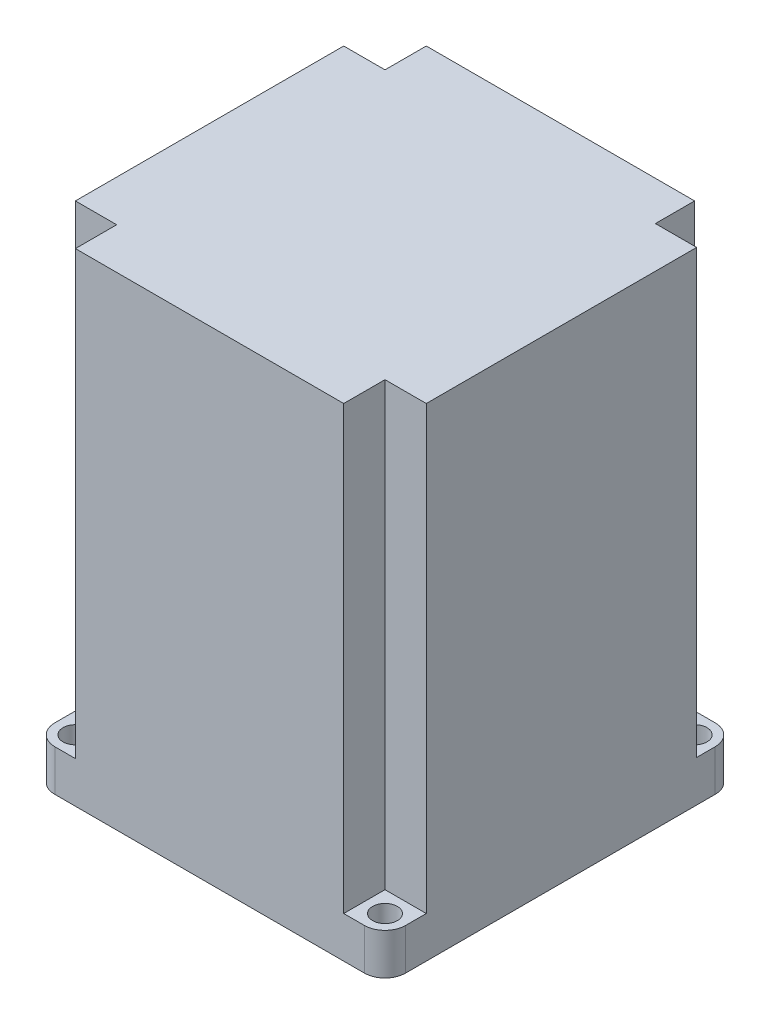
ISO-10303-21;
HEADER;
FILE_DESCRIPTION(('STEP AP214'),'2;1');
FILE_NAME('part.step','',(''),(''),'','','');
FILE_SCHEMA(('AUTOMOTIVE_DESIGN { 1 0 10303 214 1 1 1 1 }'));
ENDSEC;
DATA;
#1=APPLICATION_CONTEXT('core data for automotive mechanical design processes');
#2=APPLICATION_PROTOCOL_DEFINITION('international standard','automotive_design',2000,#1);
#3=PRODUCT_CONTEXT('',#1,'mechanical');
#4=PRODUCT('Part','Part','',(#3));
#5=PRODUCT_RELATED_PRODUCT_CATEGORY('part','',(#4));
#6=PRODUCT_DEFINITION_FORMATION('','',#4);
#7=PRODUCT_DEFINITION_CONTEXT('part definition',#1,'design');
#8=PRODUCT_DEFINITION('design','',#6,#7);
#9=PRODUCT_DEFINITION_SHAPE('','',#8);
#10=(LENGTH_UNIT() NAMED_UNIT(*) SI_UNIT(.MILLI.,.METRE.));
#11=(NAMED_UNIT(*) PLANE_ANGLE_UNIT() SI_UNIT($,.RADIAN.));
#12=(NAMED_UNIT(*) SI_UNIT($,.STERADIAN.) SOLID_ANGLE_UNIT());
#13=UNCERTAINTY_MEASURE_WITH_UNIT(LENGTH_MEASURE(1.E-05),#10,'distance_accuracy_value','');
#14=(GEOMETRIC_REPRESENTATION_CONTEXT(3) GLOBAL_UNCERTAINTY_ASSIGNED_CONTEXT((#13)) GLOBAL_UNIT_ASSIGNED_CONTEXT((#10,
#11,#12)) REPRESENTATION_CONTEXT('',''));
#15=CARTESIAN_POINT('',(0.,0.,0.));
#16=DIRECTION('',(0.,0.,1.));
#17=DIRECTION('',(1.,0.,0.));
#18=AXIS2_PLACEMENT_3D('',#15,#16,#17);
#19=CARTESIAN_POINT('',(42.5,117.,-42.5));
#20=DIRECTION('',(-1.,0.,0.));
#21=DIRECTION('',(0.,0.,1.));
#22=AXIS2_PLACEMENT_3D('',#19,#20,#21);
#23=PLANE('',#22);
#24=DIRECTION('',(0.,0.,-1.));
#25=VECTOR('',#24,1.);
#26=CARTESIAN_POINT('',(42.5,0.,-42.5));
#27=LINE('',#26,#25);
#28=CARTESIAN_POINT('',(42.5,0.,37.5));
#29=VERTEX_POINT('',#28);
#30=CARTESIAN_POINT('',(42.5,0.,-37.5));
#31=VERTEX_POINT('',#30);
#32=EDGE_CURVE('E288',#29,#31,#27,.T.);
#33=ORIENTED_EDGE('',*,*,#32,.T.);
#34=DIRECTION('',(0.,-1.,0.));
#35=VECTOR('',#34,1.);
#36=CARTESIAN_POINT('',(42.5,117.,-37.5));
#37=LINE('',#36,#35);
#38=CARTESIAN_POINT('',(42.5,9.99999999999999,-37.5));
#39=VERTEX_POINT('',#38);
#40=EDGE_CURVE('E378',#31,#39,#37,.F.);
#41=ORIENTED_EDGE('',*,*,#40,.T.);
#42=DIRECTION('',(0.,0.,-1.));
#43=VECTOR('',#42,1.);
#44=CARTESIAN_POINT('',(42.5,9.99999999999999,-33.));
#45=LINE('',#44,#43);
#46=CARTESIAN_POINT('',(42.5,9.99999999999999,-33.));
#47=VERTEX_POINT('',#46);
#48=EDGE_CURVE('E218',#47,#39,#45,.T.);
#49=ORIENTED_EDGE('',*,*,#48,.F.);
#50=DIRECTION('',(0.,1.,0.));
#51=VECTOR('',#50,1.);
#52=CARTESIAN_POINT('',(42.5,9.99999999999999,-33.));
#53=LINE('',#52,#51);
#54=CARTESIAN_POINT('',(42.5,117.,-33.));
#55=VERTEX_POINT('',#54);
#56=EDGE_CURVE('E235',#47,#55,#53,.T.);
#57=ORIENTED_EDGE('',*,*,#56,.T.);
#58=DIRECTION('',(0.,0.,-1.));
#59=VECTOR('',#58,1.);
#60=CARTESIAN_POINT('',(42.5,117.,-42.5));
#61=LINE('',#60,#59);
#62=CARTESIAN_POINT('',(42.5,117.,32.5));
#63=VERTEX_POINT('',#62);
#64=EDGE_CURVE('E207',#63,#55,#61,.T.);
#65=ORIENTED_EDGE('',*,*,#64,.F.);
#66=DIRECTION('',(0.,1.,0.));
#67=VECTOR('',#66,1.);
#68=CARTESIAN_POINT('',(42.5,9.99999999999999,32.5));
#69=LINE('',#68,#67);
#70=CARTESIAN_POINT('',(42.5,9.99999999999999,32.5));
#71=VERTEX_POINT('',#70);
#72=EDGE_CURVE('E195',#71,#63,#69,.T.);
#73=ORIENTED_EDGE('',*,*,#72,.F.);
#74=DIRECTION('',(0.,0.,-1.));
#75=VECTOR('',#74,1.);
#76=CARTESIAN_POINT('',(42.5,9.99999999999999,32.5));
#77=LINE('',#76,#75);
#78=CARTESIAN_POINT('',(42.5,9.99999999999999,37.5));
#79=VERTEX_POINT('',#78);
#80=EDGE_CURVE('E180',#79,#71,#77,.T.);
#81=ORIENTED_EDGE('',*,*,#80,.F.);
#82=DIRECTION('',(0.,-1.,0.));
#83=VECTOR('',#82,1.);
#84=CARTESIAN_POINT('',(42.5,117.,37.5));
#85=LINE('',#84,#83);
#86=EDGE_CURVE('E375',#79,#29,#85,.T.);
#87=ORIENTED_EDGE('',*,*,#86,.T.);
#88=EDGE_LOOP('',(#33,#41,#49,#57,#65,#73,#81,#87));
#89=FACE_BOUND('',#88,.T.);
#90=ADVANCED_FACE('F41',(#89),#23,.F.);
#91=CARTESIAN_POINT('',(-42.5,117.,-42.5));
#92=DIRECTION('',(0.,0.,1.));
#93=DIRECTION('',(1.,0.,0.));
#94=AXIS2_PLACEMENT_3D('',#91,#92,#93);
#95=PLANE('',#94);
#96=DIRECTION('',(-1.,0.,0.));
#97=VECTOR('',#96,1.);
#98=CARTESIAN_POINT('',(-42.5,0.,-42.5));
#99=LINE('',#98,#97);
#100=CARTESIAN_POINT('',(37.5,0.,-42.5));
#101=VERTEX_POINT('',#100);
#102=CARTESIAN_POINT('',(-37.5,0.,-42.5));
#103=VERTEX_POINT('',#102);
#104=EDGE_CURVE('E313',#101,#103,#99,.T.);
#105=ORIENTED_EDGE('',*,*,#104,.T.);
#106=DIRECTION('',(0.,-1.,0.));
#107=VECTOR('',#106,1.);
#108=CARTESIAN_POINT('',(-37.5,117.,-42.5));
#109=LINE('',#108,#107);
#110=CARTESIAN_POINT('',(-37.5,9.99999999999999,-42.5));
#111=VERTEX_POINT('',#110);
#112=EDGE_CURVE('E369',#103,#111,#109,.F.);
#113=ORIENTED_EDGE('',*,*,#112,.T.);
#114=DIRECTION('',(-1.,0.,0.));
#115=VECTOR('',#114,1.);
#116=CARTESIAN_POINT('',(-42.5,9.99999999999999,-42.5));
#117=LINE('',#116,#115);
#118=CARTESIAN_POINT('',(-32.5,9.99999999999999,-42.5));
#119=VERTEX_POINT('',#118);
#120=EDGE_CURVE('E279',#119,#111,#117,.T.);
#121=ORIENTED_EDGE('',*,*,#120,.F.);
#122=DIRECTION('',(0.,1.,0.));
#123=VECTOR('',#122,1.);
#124=CARTESIAN_POINT('',(-32.5,9.99999999999999,-42.5));
#125=LINE('',#124,#123);
#126=CARTESIAN_POINT('',(-32.5,117.,-42.5));
#127=VERTEX_POINT('',#126);
#128=EDGE_CURVE('E284',#119,#127,#125,.T.);
#129=ORIENTED_EDGE('',*,*,#128,.T.);
#130=DIRECTION('',(-1.,0.,0.));
#131=VECTOR('',#130,1.);
#132=CARTESIAN_POINT('',(-42.5,117.,-42.5));
#133=LINE('',#132,#131);
#134=CARTESIAN_POINT('',(32.5,117.,-42.5));
#135=VERTEX_POINT('',#134);
#136=EDGE_CURVE('E297',#135,#127,#133,.T.);
#137=ORIENTED_EDGE('',*,*,#136,.F.);
#138=DIRECTION('',(0.,1.,0.));
#139=VECTOR('',#138,1.);
#140=CARTESIAN_POINT('',(32.5,9.99999999999999,-42.5));
#141=LINE('',#140,#139);
#142=CARTESIAN_POINT('',(32.5,9.99999999999999,-42.5));
#143=VERTEX_POINT('',#142);
#144=EDGE_CURVE('E234',#143,#135,#141,.T.);
#145=ORIENTED_EDGE('',*,*,#144,.F.);
#146=DIRECTION('',(-1.,0.,0.));
#147=VECTOR('',#146,1.);
#148=CARTESIAN_POINT('',(42.5,9.99999999999999,-42.5));
#149=LINE('',#148,#147);
#150=CARTESIAN_POINT('',(37.5,9.99999999999999,-42.5));
#151=VERTEX_POINT('',#150);
#152=EDGE_CURVE('E222',#151,#143,#149,.T.);
#153=ORIENTED_EDGE('',*,*,#152,.F.);
#154=DIRECTION('',(0.,-1.,0.));
#155=VECTOR('',#154,1.);
#156=CARTESIAN_POINT('',(37.5,117.,-42.5));
#157=LINE('',#156,#155);
#158=EDGE_CURVE('E365',#151,#101,#157,.T.);
#159=ORIENTED_EDGE('',*,*,#158,.T.);
#160=EDGE_LOOP('',(#105,#113,#121,#129,#137,#145,#153,#159));
#161=FACE_BOUND('',#160,.T.);
#162=ADVANCED_FACE('F463',(#161),#95,.F.);
#163=CARTESIAN_POINT('',(-42.5,117.,-42.5));
#164=DIRECTION('',(1.,0.,0.));
#165=DIRECTION('',(0.,0.,-1.));
#166=AXIS2_PLACEMENT_3D('',#163,#164,#165);
#167=PLANE('',#166);
#168=DIRECTION('',(0.,0.,1.));
#169=VECTOR('',#168,1.);
#170=CARTESIAN_POINT('',(-42.5,9.99999999999999,-32.5));
#171=LINE('',#170,#169);
#172=CARTESIAN_POINT('',(-42.5,9.99999999999999,-37.5));
#173=VERTEX_POINT('',#172);
#174=CARTESIAN_POINT('',(-42.5,9.99999999999999,-32.5));
#175=VERTEX_POINT('',#174);
#176=EDGE_CURVE('E238',#173,#175,#171,.T.);
#177=ORIENTED_EDGE('',*,*,#176,.F.);
#178=DIRECTION('',(0.,-1.,0.));
#179=VECTOR('',#178,1.);
#180=CARTESIAN_POINT('',(-42.5,117.,-37.5));
#181=LINE('',#180,#179);
#182=CARTESIAN_POINT('',(-42.5,0.,-37.5));
#183=VERTEX_POINT('',#182);
#184=EDGE_CURVE('E349',#173,#183,#181,.T.);
#185=ORIENTED_EDGE('',*,*,#184,.T.);
#186=DIRECTION('',(0.,0.,1.));
#187=VECTOR('',#186,1.);
#188=CARTESIAN_POINT('',(-42.5,0.,-42.5));
#189=LINE('',#188,#187);
#190=CARTESIAN_POINT('',(-42.5,0.,37.5));
#191=VERTEX_POINT('',#190);
#192=EDGE_CURVE('E317',#183,#191,#189,.T.);
#193=ORIENTED_EDGE('',*,*,#192,.T.);
#194=DIRECTION('',(0.,-1.,0.));
#195=VECTOR('',#194,1.);
#196=CARTESIAN_POINT('',(-42.5,117.,37.5));
#197=LINE('',#196,#195);
#198=CARTESIAN_POINT('',(-42.5,9.99999999999999,37.5));
#199=VERTEX_POINT('',#198);
#200=EDGE_CURVE('E346',#191,#199,#197,.F.);
#201=ORIENTED_EDGE('',*,*,#200,.T.);
#202=DIRECTION('',(0.,0.,1.));
#203=VECTOR('',#202,1.);
#204=CARTESIAN_POINT('',(-42.5,9.99999999999999,32.5));
#205=LINE('',#204,#203);
#206=CARTESIAN_POINT('',(-42.5,9.99999999999999,32.5));
#207=VERTEX_POINT('',#206);
#208=EDGE_CURVE('E245',#207,#199,#205,.T.);
#209=ORIENTED_EDGE('',*,*,#208,.F.);
#210=DIRECTION('',(0.,1.,0.));
#211=VECTOR('',#210,1.);
#212=CARTESIAN_POINT('',(-42.5,9.99999999999999,32.5));
#213=LINE('',#212,#211);
#214=CARTESIAN_POINT('',(-42.5,117.,32.5));
#215=VERTEX_POINT('',#214);
#216=EDGE_CURVE('E223',#207,#215,#213,.T.);
#217=ORIENTED_EDGE('',*,*,#216,.T.);
#218=DIRECTION('',(0.,0.,1.));
#219=VECTOR('',#218,1.);
#220=CARTESIAN_POINT('',(-42.5,117.,-42.5));
#221=LINE('',#220,#219);
#222=CARTESIAN_POINT('',(-42.5,117.,-32.5));
#223=VERTEX_POINT('',#222);
#224=EDGE_CURVE('E302',#223,#215,#221,.T.);
#225=ORIENTED_EDGE('',*,*,#224,.F.);
#226=DIRECTION('',(0.,1.,0.));
#227=VECTOR('',#226,1.);
#228=CARTESIAN_POINT('',(-42.5,9.99999999999999,-32.5));
#229=LINE('',#228,#227);
#230=EDGE_CURVE('E283',#175,#223,#229,.T.);
#231=ORIENTED_EDGE('',*,*,#230,.F.);
#232=EDGE_LOOP('',(#177,#185,#193,#201,#209,#217,#225,#231));
#233=FACE_BOUND('',#232,.T.);
#234=ADVANCED_FACE('F476',(#233),#167,.F.);
#235=CARTESIAN_POINT('',(-42.5,117.,42.5));
#236=DIRECTION('',(0.,0.,-1.));
#237=DIRECTION('',(-1.,0.,0.));
#238=AXIS2_PLACEMENT_3D('',#235,#236,#237);
#239=PLANE('',#238);
#240=DIRECTION('',(1.,0.,0.));
#241=VECTOR('',#240,1.);
#242=CARTESIAN_POINT('',(-42.5,0.,42.5));
#243=LINE('',#242,#241);
#244=CARTESIAN_POINT('',(-37.5,0.,42.5));
#245=VERTEX_POINT('',#244);
#246=CARTESIAN_POINT('',(37.5,0.,42.5));
#247=VERTEX_POINT('',#246);
#248=EDGE_CURVE('E298',#245,#247,#243,.T.);
#249=ORIENTED_EDGE('',*,*,#248,.T.);
#250=DIRECTION('',(0.,-1.,0.));
#251=VECTOR('',#250,1.);
#252=CARTESIAN_POINT('',(37.5,117.,42.5));
#253=LINE('',#252,#251);
#254=CARTESIAN_POINT('',(37.5,9.99999999999999,42.5));
#255=VERTEX_POINT('',#254);
#256=EDGE_CURVE('E57',#247,#255,#253,.F.);
#257=ORIENTED_EDGE('',*,*,#256,.T.);
#258=DIRECTION('',(1.,0.,0.));
#259=VECTOR('',#258,1.);
#260=CARTESIAN_POINT('',(42.5,9.99999999999999,42.5));
#261=LINE('',#260,#259);
#262=CARTESIAN_POINT('',(32.5,9.99999999999999,42.5));
#263=VERTEX_POINT('',#262);
#264=EDGE_CURVE('E209',#263,#255,#261,.T.);
#265=ORIENTED_EDGE('',*,*,#264,.F.);
#266=DIRECTION('',(0.,1.,0.));
#267=VECTOR('',#266,1.);
#268=CARTESIAN_POINT('',(32.5,9.99999999999999,42.5));
#269=LINE('',#268,#267);
#270=CARTESIAN_POINT('',(32.5,117.,42.5));
#271=VERTEX_POINT('',#270);
#272=EDGE_CURVE('E213',#263,#271,#269,.T.);
#273=ORIENTED_EDGE('',*,*,#272,.T.);
#274=DIRECTION('',(1.,0.,0.));
#275=VECTOR('',#274,1.);
#276=CARTESIAN_POINT('',(-42.5,117.,42.5));
#277=LINE('',#276,#275);
#278=CARTESIAN_POINT('',(-32.5,117.,42.5));
#279=VERTEX_POINT('',#278);
#280=EDGE_CURVE('E306',#279,#271,#277,.T.);
#281=ORIENTED_EDGE('',*,*,#280,.F.);
#282=DIRECTION('',(0.,1.,0.));
#283=VECTOR('',#282,1.);
#284=CARTESIAN_POINT('',(-32.5,9.99999999999999,42.5));
#285=LINE('',#284,#283);
#286=CARTESIAN_POINT('',(-32.5,9.99999999999999,42.5));
#287=VERTEX_POINT('',#286);
#288=EDGE_CURVE('E259',#287,#279,#285,.T.);
#289=ORIENTED_EDGE('',*,*,#288,.F.);
#290=DIRECTION('',(1.,0.,0.));
#291=VECTOR('',#290,1.);
#292=CARTESIAN_POINT('',(-42.5,9.99999999999999,42.5));
#293=LINE('',#292,#291);
#294=CARTESIAN_POINT('',(-37.5,9.99999999999999,42.5));
#295=VERTEX_POINT('',#294);
#296=EDGE_CURVE('E248',#295,#287,#293,.T.);
#297=ORIENTED_EDGE('',*,*,#296,.F.);
#298=DIRECTION('',(0.,-1.,0.));
#299=VECTOR('',#298,1.);
#300=CARTESIAN_POINT('',(-37.5,117.,42.5));
#301=LINE('',#300,#299);
#302=EDGE_CURVE('E384',#295,#245,#301,.T.);
#303=ORIENTED_EDGE('',*,*,#302,.T.);
#304=EDGE_LOOP('',(#249,#257,#265,#273,#281,#289,#297,#303));
#305=FACE_BOUND('',#304,.T.);
#306=ADVANCED_FACE('F503',(#305),#239,.F.);
#307=CARTESIAN_POINT('',(0.,117.,0.));
#308=DIRECTION('',(0.,1.,0.));
#309=DIRECTION('',(0.,0.,1.));
#310=AXIS2_PLACEMENT_3D('',#307,#308,#309);
#311=PLANE('',#310);
#312=DIRECTION('',(1.,0.,0.));
#313=VECTOR('',#312,1.);
#314=CARTESIAN_POINT('',(0.,117.,-33.));
#315=LINE('',#314,#313);
#316=CARTESIAN_POINT('',(32.5,117.,-33.));
#317=VERTEX_POINT('',#316);
#318=EDGE_CURVE('E343',#317,#55,#315,.T.);
#319=ORIENTED_EDGE('',*,*,#318,.F.);
#320=DIRECTION('',(0.,0.,1.));
#321=VECTOR('',#320,1.);
#322=CARTESIAN_POINT('',(32.5,117.,0.));
#323=LINE('',#322,#321);
#324=EDGE_CURVE('E340',#135,#317,#323,.T.);
#325=ORIENTED_EDGE('',*,*,#324,.F.);
#326=ORIENTED_EDGE('',*,*,#136,.T.);
#327=DIRECTION('',(0.,0.,-1.));
#328=VECTOR('',#327,1.);
#329=CARTESIAN_POINT('',(-32.5,117.,0.));
#330=LINE('',#329,#328);
#331=CARTESIAN_POINT('',(-32.5,117.,-32.5));
#332=VERTEX_POINT('',#331);
#333=EDGE_CURVE('E325',#332,#127,#330,.T.);
#334=ORIENTED_EDGE('',*,*,#333,.F.);
#335=DIRECTION('',(1.,0.,0.));
#336=VECTOR('',#335,1.);
#337=CARTESIAN_POINT('',(0.,117.,-32.5));
#338=LINE('',#337,#336);
#339=EDGE_CURVE('E310',#223,#332,#338,.T.);
#340=ORIENTED_EDGE('',*,*,#339,.F.);
#341=ORIENTED_EDGE('',*,*,#224,.T.);
#342=DIRECTION('',(-1.,0.,0.));
#343=VECTOR('',#342,1.);
#344=CARTESIAN_POINT('',(0.,117.,32.5));
#345=LINE('',#344,#343);
#346=CARTESIAN_POINT('',(-32.5,117.,32.5));
#347=VERTEX_POINT('',#346);
#348=EDGE_CURVE('E337',#347,#215,#345,.T.);
#349=ORIENTED_EDGE('',*,*,#348,.F.);
#350=DIRECTION('',(0.,0.,-1.));
#351=VECTOR('',#350,1.);
#352=CARTESIAN_POINT('',(-32.5,117.,0.));
#353=LINE('',#352,#351);
#354=EDGE_CURVE('E334',#279,#347,#353,.T.);
#355=ORIENTED_EDGE('',*,*,#354,.F.);
#356=ORIENTED_EDGE('',*,*,#280,.T.);
#357=DIRECTION('',(0.,0.,1.));
#358=VECTOR('',#357,1.);
#359=CARTESIAN_POINT('',(32.5,117.,0.));
#360=LINE('',#359,#358);
#361=CARTESIAN_POINT('',(32.5,117.,32.5));
#362=VERTEX_POINT('',#361);
#363=EDGE_CURVE('E331',#362,#271,#360,.T.);
#364=ORIENTED_EDGE('',*,*,#363,.F.);
#365=DIRECTION('',(-1.,0.,0.));
#366=VECTOR('',#365,1.);
#367=CARTESIAN_POINT('',(0.,117.,32.5));
#368=LINE('',#367,#366);
#369=EDGE_CURVE('E328',#63,#362,#368,.T.);
#370=ORIENTED_EDGE('',*,*,#369,.F.);
#371=ORIENTED_EDGE('',*,*,#64,.T.);
#372=EDGE_LOOP('',(#319,#325,#326,#334,#340,#341,#349,#355,#356,#364,#370,#371));
#373=FACE_BOUND('',#372,.T.);
#374=ADVANCED_FACE('F495',(#373),#311,.T.);
#375=CARTESIAN_POINT('',(0.,0.,0.));
#376=DIRECTION('',(0.,1.,0.));
#377=DIRECTION('',(0.,0.,1.));
#378=AXIS2_PLACEMENT_3D('',#375,#376,#377);
#379=PLANE('',#378);
#380=CARTESIAN_POINT('',(37.5,0.,37.5));
#381=DIRECTION('',(0.,-1.,0.));
#382=DIRECTION('',(0.,0.,-1.));
#383=AXIS2_PLACEMENT_3D('',#380,#381,#382);
#384=CIRCLE('',#383,3.);
#385=CARTESIAN_POINT('',(37.5,0.,34.5));
#386=VERTEX_POINT('',#385);
#387=EDGE_CURVE('E419',#386,#386,#384,.T.);
#388=ORIENTED_EDGE('',*,*,#387,.F.);
#389=EDGE_LOOP('',(#388));
#390=FACE_BOUND('',#389,.T.);
#391=CARTESIAN_POINT('',(-37.5,0.,-37.5));
#392=DIRECTION('',(0.,-1.,0.));
#393=DIRECTION('',(0.,0.,-1.));
#394=AXIS2_PLACEMENT_3D('',#391,#392,#393);
#395=CIRCLE('',#394,3.);
#396=CARTESIAN_POINT('',(-37.5,0.,-40.5));
#397=VERTEX_POINT('',#396);
#398=EDGE_CURVE('E420',#397,#397,#395,.T.);
#399=ORIENTED_EDGE('',*,*,#398,.F.);
#400=EDGE_LOOP('',(#399));
#401=FACE_BOUND('',#400,.T.);
#402=CARTESIAN_POINT('',(37.5,0.,-37.5));
#403=DIRECTION('',(0.,-1.,0.));
#404=DIRECTION('',(0.,0.,-1.));
#405=AXIS2_PLACEMENT_3D('',#402,#403,#404);
#406=CIRCLE('',#405,3.);
#407=CARTESIAN_POINT('',(37.5,0.,-40.5));
#408=VERTEX_POINT('',#407);
#409=EDGE_CURVE('E429',#408,#408,#406,.T.);
#410=ORIENTED_EDGE('',*,*,#409,.F.);
#411=EDGE_LOOP('',(#410));
#412=FACE_BOUND('',#411,.T.);
#413=CARTESIAN_POINT('',(-37.5,0.,37.5));
#414=DIRECTION('',(0.,-1.,0.));
#415=DIRECTION('',(0.,0.,-1.));
#416=AXIS2_PLACEMENT_3D('',#413,#414,#415);
#417=CIRCLE('',#416,3.);
#418=CARTESIAN_POINT('',(-37.5,0.,34.5));
#419=VERTEX_POINT('',#418);
#420=EDGE_CURVE('E415',#419,#419,#417,.T.);
#421=ORIENTED_EDGE('',*,*,#420,.F.);
#422=EDGE_LOOP('',(#421));
#423=FACE_BOUND('',#422,.T.);
#424=CARTESIAN_POINT('',(0.,0.,0.));
#425=DIRECTION('',(0.,-1.,0.));
#426=DIRECTION('',(0.,0.,-1.));
#427=AXIS2_PLACEMENT_3D('',#424,#425,#426);
#428=CIRCLE('',#427,31.);
#429=CARTESIAN_POINT('',(0.,0.,-31.));
#430=VERTEX_POINT('',#429);
#431=EDGE_CURVE('E396',#430,#430,#428,.T.);
#432=ORIENTED_EDGE('',*,*,#431,.F.);
#433=EDGE_LOOP('',(#432));
#434=FACE_BOUND('',#433,.T.);
#435=ORIENTED_EDGE('',*,*,#192,.F.);
#436=CARTESIAN_POINT('',(-37.5,0.,-37.5));
#437=DIRECTION('',(0.,1.,0.));
#438=DIRECTION('',(0.,0.,1.));
#439=AXIS2_PLACEMENT_3D('',#436,#437,#438);
#440=CIRCLE('',#439,5.);
#441=EDGE_CURVE('E362',#183,#103,#440,.F.);
#442=ORIENTED_EDGE('',*,*,#441,.T.);
#443=ORIENTED_EDGE('',*,*,#104,.F.);
#444=CARTESIAN_POINT('',(37.5,0.,-37.5));
#445=DIRECTION('',(0.,1.,0.));
#446=DIRECTION('',(0.,0.,1.));
#447=AXIS2_PLACEMENT_3D('',#444,#445,#446);
#448=CIRCLE('',#447,5.);
#449=EDGE_CURVE('E359',#101,#31,#448,.F.);
#450=ORIENTED_EDGE('',*,*,#449,.T.);
#451=ORIENTED_EDGE('',*,*,#32,.F.);
#452=CARTESIAN_POINT('',(37.5,0.,37.5));
#453=DIRECTION('',(0.,1.,0.));
#454=DIRECTION('',(0.,0.,1.));
#455=AXIS2_PLACEMENT_3D('',#452,#453,#454);
#456=CIRCLE('',#455,5.);
#457=EDGE_CURVE('E356',#29,#247,#456,.F.);
#458=ORIENTED_EDGE('',*,*,#457,.T.);
#459=ORIENTED_EDGE('',*,*,#248,.F.);
#460=CARTESIAN_POINT('',(-37.5,0.,37.5));
#461=DIRECTION('',(0.,1.,0.));
#462=DIRECTION('',(0.,0.,1.));
#463=AXIS2_PLACEMENT_3D('',#460,#461,#462);
#464=CIRCLE('',#463,5.);
#465=EDGE_CURVE('E353',#245,#191,#464,.F.);
#466=ORIENTED_EDGE('',*,*,#465,.T.);
#467=EDGE_LOOP('',(#435,#442,#443,#450,#451,#458,#459,#466));
#468=FACE_BOUND('',#467,.T.);
#469=ADVANCED_FACE('F468',(#390,#401,#412,#423,#434,#468),#379,.F.);
#470=CARTESIAN_POINT('',(-32.5,9.99999999999999,-42.5));
#471=DIRECTION('',(1.,0.,0.));
#472=DIRECTION('',(0.,0.,-1.));
#473=AXIS2_PLACEMENT_3D('',#470,#471,#472);
#474=PLANE('',#473);
#475=ORIENTED_EDGE('',*,*,#333,.T.);
#476=ORIENTED_EDGE('',*,*,#128,.F.);
#477=DIRECTION('',(0.,0.,-1.));
#478=VECTOR('',#477,1.);
#479=CARTESIAN_POINT('',(-32.5,9.99999999999999,-42.5));
#480=LINE('',#479,#478);
#481=CARTESIAN_POINT('',(-32.5,9.99999999999999,-32.5));
#482=VERTEX_POINT('',#481);
#483=EDGE_CURVE('E275',#482,#119,#480,.T.);
#484=ORIENTED_EDGE('',*,*,#483,.F.);
#485=DIRECTION('',(0.,1.,0.));
#486=VECTOR('',#485,1.);
#487=CARTESIAN_POINT('',(-32.5,9.99999999999999,-32.5));
#488=LINE('',#487,#486);
#489=EDGE_CURVE('E289',#482,#332,#488,.T.);
#490=ORIENTED_EDGE('',*,*,#489,.T.);
#491=EDGE_LOOP('',(#475,#476,#484,#490));
#492=FACE_BOUND('',#491,.T.);
#493=ADVANCED_FACE('F489',(#492),#474,.F.);
#494=CARTESIAN_POINT('',(-32.5,9.99999999999999,-32.5));
#495=DIRECTION('',(0.,0.,1.));
#496=DIRECTION('',(1.,0.,0.));
#497=AXIS2_PLACEMENT_3D('',#494,#495,#496);
#498=PLANE('',#497);
#499=ORIENTED_EDGE('',*,*,#339,.T.);
#500=ORIENTED_EDGE('',*,*,#489,.F.);
#501=DIRECTION('',(1.,0.,0.));
#502=VECTOR('',#501,1.);
#503=CARTESIAN_POINT('',(-32.5,9.99999999999999,-32.5));
#504=LINE('',#503,#502);
#505=EDGE_CURVE('E271',#175,#482,#504,.T.);
#506=ORIENTED_EDGE('',*,*,#505,.F.);
#507=ORIENTED_EDGE('',*,*,#230,.T.);
#508=EDGE_LOOP('',(#499,#500,#506,#507));
#509=FACE_BOUND('',#508,.T.);
#510=ADVANCED_FACE('F484',(#509),#498,.F.);
#511=CARTESIAN_POINT('',(0.,9.99999999999999,0.));
#512=DIRECTION('',(0.,-1.,0.));
#513=DIRECTION('',(0.,0.,-1.));
#514=AXIS2_PLACEMENT_3D('',#511,#512,#513);
#515=PLANE('',#514);
#516=CARTESIAN_POINT('',(-37.5,9.99999999999999,-37.5));
#517=DIRECTION('',(0.,-1.,0.));
#518=DIRECTION('',(0.,0.,-1.));
#519=AXIS2_PLACEMENT_3D('',#516,#517,#518);
#520=CIRCLE('',#519,3.);
#521=CARTESIAN_POINT('',(-37.5,9.99999999999999,-40.5));
#522=VERTEX_POINT('',#521);
#523=EDGE_CURVE('E425',#522,#522,#520,.F.);
#524=ORIENTED_EDGE('',*,*,#523,.F.);
#525=EDGE_LOOP('',(#524));
#526=FACE_BOUND('',#525,.T.);
#527=ORIENTED_EDGE('',*,*,#120,.T.);
#528=CARTESIAN_POINT('',(-37.5,9.99999999999999,-37.5));
#529=DIRECTION('',(0.,-1.,0.));
#530=DIRECTION('',(0.,0.,-1.));
#531=AXIS2_PLACEMENT_3D('',#528,#529,#530);
#532=CIRCLE('',#531,5.);
#533=EDGE_CURVE('E372',#111,#173,#532,.F.);
#534=ORIENTED_EDGE('',*,*,#533,.T.);
#535=ORIENTED_EDGE('',*,*,#176,.T.);
#536=ORIENTED_EDGE('',*,*,#505,.T.);
#537=ORIENTED_EDGE('',*,*,#483,.T.);
#538=EDGE_LOOP('',(#527,#534,#535,#536,#537));
#539=FACE_BOUND('',#538,.T.);
#540=ADVANCED_FACE('F482',(#526,#539),#515,.F.);
#541=CARTESIAN_POINT('',(32.5,9.99999999999999,42.5));
#542=DIRECTION('',(-1.,0.,0.));
#543=DIRECTION('',(0.,0.,1.));
#544=AXIS2_PLACEMENT_3D('',#541,#542,#543);
#545=PLANE('',#544);
#546=ORIENTED_EDGE('',*,*,#363,.T.);
#547=ORIENTED_EDGE('',*,*,#272,.F.);
#548=DIRECTION('',(0.,0.,1.));
#549=VECTOR('',#548,1.);
#550=CARTESIAN_POINT('',(32.5,9.99999999999999,42.5));
#551=LINE('',#550,#549);
#552=CARTESIAN_POINT('',(32.5,9.99999999999999,32.5));
#553=VERTEX_POINT('',#552);
#554=EDGE_CURVE('E201',#553,#263,#551,.T.);
#555=ORIENTED_EDGE('',*,*,#554,.F.);
#556=DIRECTION('',(0.,1.,0.));
#557=VECTOR('',#556,1.);
#558=CARTESIAN_POINT('',(32.5,9.99999999999999,32.5));
#559=LINE('',#558,#557);
#560=EDGE_CURVE('E198',#553,#362,#559,.T.);
#561=ORIENTED_EDGE('',*,*,#560,.T.);
#562=EDGE_LOOP('',(#546,#547,#555,#561));
#563=FACE_BOUND('',#562,.T.);
#564=ADVANCED_FACE('F502',(#563),#545,.F.);
#565=CARTESIAN_POINT('',(32.5,9.99999999999999,32.5));
#566=DIRECTION('',(0.,0.,-1.));
#567=DIRECTION('',(-1.,0.,0.));
#568=AXIS2_PLACEMENT_3D('',#565,#566,#567);
#569=PLANE('',#568);
#570=ORIENTED_EDGE('',*,*,#369,.T.);
#571=ORIENTED_EDGE('',*,*,#560,.F.);
#572=DIRECTION('',(-1.,0.,0.));
#573=VECTOR('',#572,1.);
#574=CARTESIAN_POINT('',(32.5,9.99999999999999,32.5));
#575=LINE('',#574,#573);
#576=EDGE_CURVE('E184',#71,#553,#575,.T.);
#577=ORIENTED_EDGE('',*,*,#576,.F.);
#578=ORIENTED_EDGE('',*,*,#72,.T.);
#579=EDGE_LOOP('',(#570,#571,#577,#578));
#580=FACE_BOUND('',#579,.T.);
#581=ADVANCED_FACE('F194',(#580),#569,.F.);
#582=CARTESIAN_POINT('',(0.,9.99999999999999,0.));
#583=DIRECTION('',(0.,-1.,0.));
#584=DIRECTION('',(0.,0.,-1.));
#585=AXIS2_PLACEMENT_3D('',#582,#583,#584);
#586=PLANE('',#585);
#587=CARTESIAN_POINT('',(37.5,9.99999999999999,37.5));
#588=DIRECTION('',(0.,-1.,0.));
#589=DIRECTION('',(0.,0.,-1.));
#590=AXIS2_PLACEMENT_3D('',#587,#588,#589);
#591=CIRCLE('',#590,3.);
#592=CARTESIAN_POINT('',(37.5,9.99999999999999,34.5));
#593=VERTEX_POINT('',#592);
#594=EDGE_CURVE('E424',#593,#593,#591,.F.);
#595=ORIENTED_EDGE('',*,*,#594,.F.);
#596=EDGE_LOOP('',(#595));
#597=FACE_BOUND('',#596,.T.);
#598=ORIENTED_EDGE('',*,*,#264,.T.);
#599=CARTESIAN_POINT('',(37.5,9.99999999999999,37.5));
#600=DIRECTION('',(0.,-1.,0.));
#601=DIRECTION('',(0.,0.,-1.));
#602=AXIS2_PLACEMENT_3D('',#599,#600,#601);
#603=CIRCLE('',#602,5.);
#604=EDGE_CURVE('E50',#255,#79,#603,.F.);
#605=ORIENTED_EDGE('',*,*,#604,.T.);
#606=ORIENTED_EDGE('',*,*,#80,.T.);
#607=ORIENTED_EDGE('',*,*,#576,.T.);
#608=ORIENTED_EDGE('',*,*,#554,.T.);
#609=EDGE_LOOP('',(#598,#605,#606,#607,#608));
#610=FACE_BOUND('',#609,.T.);
#611=ADVANCED_FACE('F182',(#597,#610),#586,.F.);
#612=CARTESIAN_POINT('',(-32.5,9.99999999999999,32.5));
#613=DIRECTION('',(0.,0.,-1.));
#614=DIRECTION('',(-1.,0.,0.));
#615=AXIS2_PLACEMENT_3D('',#612,#613,#614);
#616=PLANE('',#615);
#617=ORIENTED_EDGE('',*,*,#348,.T.);
#618=ORIENTED_EDGE('',*,*,#216,.F.);
#619=DIRECTION('',(-1.,0.,0.));
#620=VECTOR('',#619,1.);
#621=CARTESIAN_POINT('',(-32.5,9.99999999999999,32.5));
#622=LINE('',#621,#620);
#623=CARTESIAN_POINT('',(-32.5,9.99999999999999,32.5));
#624=VERTEX_POINT('',#623);
#625=EDGE_CURVE('E255',#624,#207,#622,.T.);
#626=ORIENTED_EDGE('',*,*,#625,.F.);
#627=DIRECTION('',(0.,1.,0.));
#628=VECTOR('',#627,1.);
#629=CARTESIAN_POINT('',(-32.5,9.99999999999999,32.5));
#630=LINE('',#629,#628);
#631=EDGE_CURVE('E263',#624,#347,#630,.T.);
#632=ORIENTED_EDGE('',*,*,#631,.T.);
#633=EDGE_LOOP('',(#617,#618,#626,#632));
#634=FACE_BOUND('',#633,.T.);
#635=ADVANCED_FACE('F542',(#634),#616,.F.);
#636=CARTESIAN_POINT('',(-32.5,9.99999999999999,42.5));
#637=DIRECTION('',(1.,0.,0.));
#638=DIRECTION('',(0.,0.,-1.));
#639=AXIS2_PLACEMENT_3D('',#636,#637,#638);
#640=PLANE('',#639);
#641=ORIENTED_EDGE('',*,*,#354,.T.);
#642=ORIENTED_EDGE('',*,*,#631,.F.);
#643=DIRECTION('',(0.,0.,-1.));
#644=VECTOR('',#643,1.);
#645=CARTESIAN_POINT('',(-32.5,9.99999999999999,42.5));
#646=LINE('',#645,#644);
#647=EDGE_CURVE('E251',#287,#624,#646,.T.);
#648=ORIENTED_EDGE('',*,*,#647,.F.);
#649=ORIENTED_EDGE('',*,*,#288,.T.);
#650=EDGE_LOOP('',(#641,#642,#648,#649));
#651=FACE_BOUND('',#650,.T.);
#652=ADVANCED_FACE('F538',(#651),#640,.F.);
#653=CARTESIAN_POINT('',(0.,9.99999999999999,0.));
#654=DIRECTION('',(0.,1.,0.));
#655=DIRECTION('',(0.,0.,1.));
#656=AXIS2_PLACEMENT_3D('',#653,#654,#655);
#657=PLANE('',#656);
#658=CARTESIAN_POINT('',(-37.5,9.99999999999999,37.5));
#659=DIRECTION('',(0.,-1.,0.));
#660=DIRECTION('',(0.,0.,-1.));
#661=AXIS2_PLACEMENT_3D('',#658,#659,#660);
#662=CIRCLE('',#661,3.);
#663=CARTESIAN_POINT('',(-37.5,9.99999999999999,34.5));
#664=VERTEX_POINT('',#663);
#665=EDGE_CURVE('E408',#664,#664,#662,.F.);
#666=ORIENTED_EDGE('',*,*,#665,.F.);
#667=EDGE_LOOP('',(#666));
#668=FACE_BOUND('',#667,.T.);
#669=ORIENTED_EDGE('',*,*,#208,.T.);
#670=CARTESIAN_POINT('',(-37.5,9.99999999999999,37.5));
#671=DIRECTION('',(0.,1.,0.));
#672=DIRECTION('',(0.,0.,1.));
#673=AXIS2_PLACEMENT_3D('',#670,#671,#672);
#674=CIRCLE('',#673,5.);
#675=EDGE_CURVE('E11',#199,#295,#674,.T.);
#676=ORIENTED_EDGE('',*,*,#675,.T.);
#677=ORIENTED_EDGE('',*,*,#296,.T.);
#678=ORIENTED_EDGE('',*,*,#647,.T.);
#679=ORIENTED_EDGE('',*,*,#625,.T.);
#680=EDGE_LOOP('',(#669,#676,#677,#678,#679));
#681=FACE_BOUND('',#680,.T.);
#682=ADVANCED_FACE('F535',(#668,#681),#657,.T.);
#683=CARTESIAN_POINT('',(32.5,9.99999999999999,-33.));
#684=DIRECTION('',(0.,0.,1.));
#685=DIRECTION('',(1.,0.,0.));
#686=AXIS2_PLACEMENT_3D('',#683,#684,#685);
#687=PLANE('',#686);
#688=ORIENTED_EDGE('',*,*,#318,.T.);
#689=ORIENTED_EDGE('',*,*,#56,.F.);
#690=DIRECTION('',(1.,0.,0.));
#691=VECTOR('',#690,1.);
#692=CARTESIAN_POINT('',(32.5,9.99999999999999,-33.));
#693=LINE('',#692,#691);
#694=CARTESIAN_POINT('',(32.5,9.99999999999999,-33.));
#695=VERTEX_POINT('',#694);
#696=EDGE_CURVE('E230',#695,#47,#693,.T.);
#697=ORIENTED_EDGE('',*,*,#696,.F.);
#698=DIRECTION('',(0.,1.,0.));
#699=VECTOR('',#698,1.);
#700=CARTESIAN_POINT('',(32.5,9.99999999999999,-33.));
#701=LINE('',#700,#699);
#702=EDGE_CURVE('E239',#695,#317,#701,.T.);
#703=ORIENTED_EDGE('',*,*,#702,.T.);
#704=EDGE_LOOP('',(#688,#689,#697,#703));
#705=FACE_BOUND('',#704,.T.);
#706=ADVANCED_FACE('F499',(#705),#687,.F.);
#707=CARTESIAN_POINT('',(32.5,9.99999999999999,-42.5));
#708=DIRECTION('',(-1.,0.,0.));
#709=DIRECTION('',(0.,0.,1.));
#710=AXIS2_PLACEMENT_3D('',#707,#708,#709);
#711=PLANE('',#710);
#712=ORIENTED_EDGE('',*,*,#324,.T.);
#713=ORIENTED_EDGE('',*,*,#702,.F.);
#714=DIRECTION('',(0.,0.,1.));
#715=VECTOR('',#714,1.);
#716=CARTESIAN_POINT('',(32.5,9.99999999999999,-42.5));
#717=LINE('',#716,#715);
#718=EDGE_CURVE('E226',#143,#695,#717,.T.);
#719=ORIENTED_EDGE('',*,*,#718,.F.);
#720=ORIENTED_EDGE('',*,*,#144,.T.);
#721=EDGE_LOOP('',(#712,#713,#719,#720));
#722=FACE_BOUND('',#721,.T.);
#723=ADVANCED_FACE('F451',(#722),#711,.F.);
#724=CARTESIAN_POINT('',(0.,9.99999999999999,0.));
#725=DIRECTION('',(0.,1.,0.));
#726=DIRECTION('',(0.,0.,1.));
#727=AXIS2_PLACEMENT_3D('',#724,#725,#726);
#728=PLANE('',#727);
#729=CARTESIAN_POINT('',(37.5,9.99999999999999,-37.5));
#730=DIRECTION('',(0.,-1.,0.));
#731=DIRECTION('',(0.,0.,-1.));
#732=AXIS2_PLACEMENT_3D('',#729,#730,#731);
#733=CIRCLE('',#732,3.);
#734=CARTESIAN_POINT('',(37.5,9.99999999999999,-40.5));
#735=VERTEX_POINT('',#734);
#736=EDGE_CURVE('E439',#735,#735,#733,.F.);
#737=ORIENTED_EDGE('',*,*,#736,.F.);
#738=EDGE_LOOP('',(#737));
#739=FACE_BOUND('',#738,.T.);
#740=ORIENTED_EDGE('',*,*,#48,.T.);
#741=CARTESIAN_POINT('',(37.5,9.99999999999999,-37.5));
#742=DIRECTION('',(0.,1.,0.));
#743=DIRECTION('',(0.,0.,1.));
#744=AXIS2_PLACEMENT_3D('',#741,#742,#743);
#745=CIRCLE('',#744,5.);
#746=EDGE_CURVE('E381',#39,#151,#745,.T.);
#747=ORIENTED_EDGE('',*,*,#746,.T.);
#748=ORIENTED_EDGE('',*,*,#152,.T.);
#749=ORIENTED_EDGE('',*,*,#718,.T.);
#750=ORIENTED_EDGE('',*,*,#696,.T.);
#751=EDGE_LOOP('',(#740,#747,#748,#749,#750));
#752=FACE_BOUND('',#751,.T.);
#753=ADVANCED_FACE('F447',(#739,#752),#728,.T.);
#754=CARTESIAN_POINT('',(0.,2.,0.));
#755=DIRECTION('',(0.,-1.,0.));
#756=DIRECTION('',(0.,0.,-1.));
#757=AXIS2_PLACEMENT_3D('',#754,#755,#756);
#758=CYLINDRICAL_SURFACE('',#757,31.);
#759=CARTESIAN_POINT('',(0.,2.,0.));
#760=DIRECTION('',(0.,-1.,0.));
#761=DIRECTION('',(0.,0.,-1.));
#762=AXIS2_PLACEMENT_3D('',#759,#760,#761);
#763=CIRCLE('',#762,31.);
#764=CARTESIAN_POINT('',(0.,2.,-31.));
#765=VERTEX_POINT('',#764);
#766=EDGE_CURVE('E191',#765,#765,#763,.T.);
#767=ORIENTED_EDGE('',*,*,#766,.F.);
#768=EDGE_LOOP('',(#767));
#769=FACE_BOUND('',#768,.T.);
#770=ORIENTED_EDGE('',*,*,#431,.T.);
#771=EDGE_LOOP('',(#770));
#772=FACE_BOUND('',#771,.T.);
#773=ADVANCED_FACE('F450',(#769,#772),#758,.F.);
#774=CARTESIAN_POINT('',(0.,2.,0.));
#775=DIRECTION('',(0.,-1.,0.));
#776=DIRECTION('',(0.,0.,-1.));
#777=AXIS2_PLACEMENT_3D('',#774,#775,#776);
#778=PLANE('',#777);
#779=CARTESIAN_POINT('',(0.,2.,0.));
#780=DIRECTION('',(0.,-1.,0.));
#781=DIRECTION('',(0.,0.,-1.));
#782=AXIS2_PLACEMENT_3D('',#779,#780,#781);
#783=CIRCLE('',#782,8.);
#784=CARTESIAN_POINT('',(0.,2.,-8.));
#785=VERTEX_POINT('',#784);
#786=EDGE_CURVE('E404',#785,#785,#783,.T.);
#787=ORIENTED_EDGE('',*,*,#786,.F.);
#788=EDGE_LOOP('',(#787));
#789=FACE_BOUND('',#788,.T.);
#790=ORIENTED_EDGE('',*,*,#766,.T.);
#791=EDGE_LOOP('',(#790));
#792=FACE_BOUND('',#791,.T.);
#793=ADVANCED_FACE('F577',(#789,#792),#778,.T.);
#794=CARTESIAN_POINT('',(0.,-34.,0.));
#795=DIRECTION('',(0.,1.,0.));
#796=DIRECTION('',(0.,0.,1.));
#797=AXIS2_PLACEMENT_3D('',#794,#795,#796);
#798=CYLINDRICAL_SURFACE('',#797,8.);
#799=CARTESIAN_POINT('',(0.,-34.,0.));
#800=DIRECTION('',(0.,-1.,0.));
#801=DIRECTION('',(0.,0.,-1.));
#802=AXIS2_PLACEMENT_3D('',#799,#800,#801);
#803=CIRCLE('',#802,8.);
#804=CARTESIAN_POINT('',(0.,-34.,-8.));
#805=VERTEX_POINT('',#804);
#806=EDGE_CURVE('E400',#805,#805,#803,.T.);
#807=ORIENTED_EDGE('',*,*,#806,.F.);
#808=EDGE_LOOP('',(#807));
#809=FACE_BOUND('',#808,.T.);
#810=ORIENTED_EDGE('',*,*,#786,.T.);
#811=EDGE_LOOP('',(#810));
#812=FACE_BOUND('',#811,.T.);
#813=ADVANCED_FACE('F583',(#809,#812),#798,.T.);
#814=CARTESIAN_POINT('',(0.,-34.,0.));
#815=DIRECTION('',(0.,-1.,0.));
#816=DIRECTION('',(0.,0.,-1.));
#817=AXIS2_PLACEMENT_3D('',#814,#815,#816);
#818=PLANE('',#817);
#819=ORIENTED_EDGE('',*,*,#806,.T.);
#820=EDGE_LOOP('',(#819));
#821=FACE_BOUND('',#820,.T.);
#822=ADVANCED_FACE('F665',(#821),#818,.T.);
#823=CARTESIAN_POINT('',(37.5,18.4852813742386,-37.5));
#824=DIRECTION('',(0.,-1.,0.));
#825=DIRECTION('',(0.,0.,-1.));
#826=AXIS2_PLACEMENT_3D('',#823,#824,#825);
#827=CYLINDRICAL_SURFACE('',#826,3.);
#828=ORIENTED_EDGE('',*,*,#736,.T.);
#829=EDGE_LOOP('',(#828));
#830=FACE_BOUND('',#829,.T.);
#831=ORIENTED_EDGE('',*,*,#409,.T.);
#832=EDGE_LOOP('',(#831));
#833=FACE_BOUND('',#832,.T.);
#834=ADVANCED_FACE('F444',(#830,#833),#827,.F.);
#835=CARTESIAN_POINT('',(-37.5,18.4852813742386,37.5));
#836=DIRECTION('',(0.,-1.,0.));
#837=DIRECTION('',(0.,0.,-1.));
#838=AXIS2_PLACEMENT_3D('',#835,#836,#837);
#839=CYLINDRICAL_SURFACE('',#838,3.);
#840=ORIENTED_EDGE('',*,*,#665,.T.);
#841=EDGE_LOOP('',(#840));
#842=FACE_BOUND('',#841,.T.);
#843=ORIENTED_EDGE('',*,*,#420,.T.);
#844=EDGE_LOOP('',(#843));
#845=FACE_BOUND('',#844,.T.);
#846=ADVANCED_FACE('F650',(#842,#845),#839,.F.);
#847=CARTESIAN_POINT('',(37.5,18.4852813742386,37.5));
#848=DIRECTION('',(0.,-1.,0.));
#849=DIRECTION('',(0.,0.,-1.));
#850=AXIS2_PLACEMENT_3D('',#847,#848,#849);
#851=CYLINDRICAL_SURFACE('',#850,3.);
#852=ORIENTED_EDGE('',*,*,#594,.T.);
#853=EDGE_LOOP('',(#852));
#854=FACE_BOUND('',#853,.T.);
#855=ORIENTED_EDGE('',*,*,#387,.T.);
#856=EDGE_LOOP('',(#855));
#857=FACE_BOUND('',#856,.T.);
#858=ADVANCED_FACE('F642',(#854,#857),#851,.F.);
#859=CARTESIAN_POINT('',(-37.5,18.4852813742386,-37.5));
#860=DIRECTION('',(0.,-1.,0.));
#861=DIRECTION('',(0.,0.,-1.));
#862=AXIS2_PLACEMENT_3D('',#859,#860,#861);
#863=CYLINDRICAL_SURFACE('',#862,3.);
#864=ORIENTED_EDGE('',*,*,#523,.T.);
#865=EDGE_LOOP('',(#864));
#866=FACE_BOUND('',#865,.T.);
#867=ORIENTED_EDGE('',*,*,#398,.T.);
#868=EDGE_LOOP('',(#867));
#869=FACE_BOUND('',#868,.T.);
#870=ADVANCED_FACE('F523',(#866,#869),#863,.F.);
#871=CARTESIAN_POINT('',(-37.5,117.,-37.5));
#872=DIRECTION('',(0.,-1.,0.));
#873=DIRECTION('',(0.,0.,-1.));
#874=AXIS2_PLACEMENT_3D('',#871,#872,#873);
#875=CYLINDRICAL_SURFACE('',#874,5.);
#876=ORIENTED_EDGE('',*,*,#533,.F.);
#877=ORIENTED_EDGE('',*,*,#112,.F.);
#878=ORIENTED_EDGE('',*,*,#441,.F.);
#879=ORIENTED_EDGE('',*,*,#184,.F.);
#880=EDGE_LOOP('',(#876,#877,#878,#879));
#881=FACE_BOUND('',#880,.T.);
#882=ADVANCED_FACE('F473',(#881),#875,.T.);
#883=CARTESIAN_POINT('',(37.5,117.,-37.5));
#884=DIRECTION('',(0.,-1.,0.));
#885=DIRECTION('',(0.,0.,-1.));
#886=AXIS2_PLACEMENT_3D('',#883,#884,#885);
#887=CYLINDRICAL_SURFACE('',#886,5.);
#888=ORIENTED_EDGE('',*,*,#746,.F.);
#889=ORIENTED_EDGE('',*,*,#40,.F.);
#890=ORIENTED_EDGE('',*,*,#449,.F.);
#891=ORIENTED_EDGE('',*,*,#158,.F.);
#892=EDGE_LOOP('',(#888,#889,#890,#891));
#893=FACE_BOUND('',#892,.T.);
#894=ADVANCED_FACE('F460',(#893),#887,.T.);
#895=CARTESIAN_POINT('',(37.5,117.,37.5));
#896=DIRECTION('',(0.,-1.,0.));
#897=DIRECTION('',(0.,0.,-1.));
#898=AXIS2_PLACEMENT_3D('',#895,#896,#897);
#899=CYLINDRICAL_SURFACE('',#898,5.);
#900=ORIENTED_EDGE('',*,*,#604,.F.);
#901=ORIENTED_EDGE('',*,*,#256,.F.);
#902=ORIENTED_EDGE('',*,*,#457,.F.);
#903=ORIENTED_EDGE('',*,*,#86,.F.);
#904=EDGE_LOOP('',(#900,#901,#902,#903));
#905=FACE_BOUND('',#904,.T.);
#906=ADVANCED_FACE('F525',(#905),#899,.T.);
#907=CARTESIAN_POINT('',(-37.5,117.,37.5));
#908=DIRECTION('',(0.,-1.,0.));
#909=DIRECTION('',(0.,0.,-1.));
#910=AXIS2_PLACEMENT_3D('',#907,#908,#909);
#911=CYLINDRICAL_SURFACE('',#910,5.);
#912=ORIENTED_EDGE('',*,*,#675,.F.);
#913=ORIENTED_EDGE('',*,*,#200,.F.);
#914=ORIENTED_EDGE('',*,*,#465,.F.);
#915=ORIENTED_EDGE('',*,*,#302,.F.);
#916=EDGE_LOOP('',(#912,#913,#914,#915));
#917=FACE_BOUND('',#916,.T.);
#918=ADVANCED_FACE('F43',(#917),#911,.T.);
#919=CLOSED_SHELL('',(#90,#162,#234,#306,#374,#469,#493,#510,#540,#564,#581,#611,#635,#652,#682,
#706,#723,#753,#773,#793,#813,#822,#834,#846,#858,#870,#882,#894,#906,#918));
#920=MANIFOLD_SOLID_BREP('B2',#919);
#921=ADVANCED_BREP_SHAPE_REPRESENTATION('',(#18,#920),#14);
#922=SHAPE_DEFINITION_REPRESENTATION(#9,#921);
ENDSEC;
END-ISO-10303-21;
